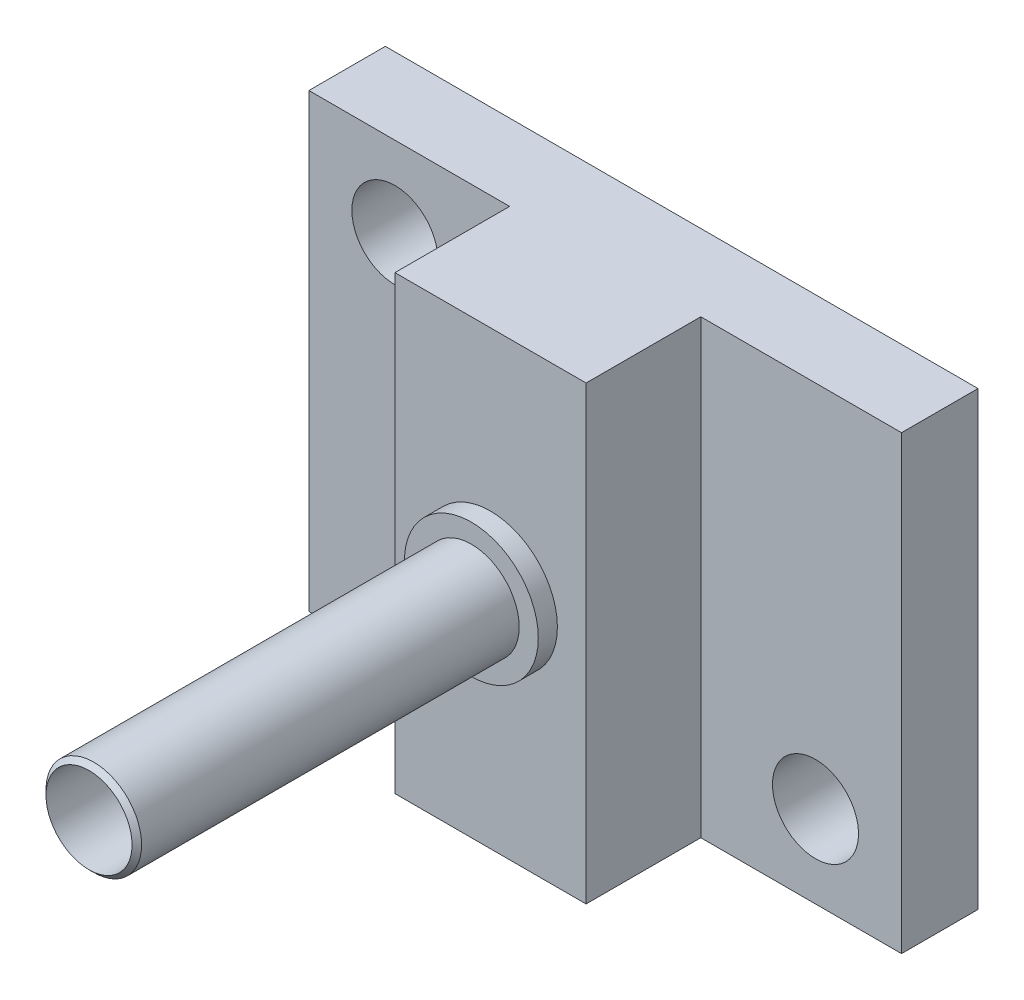
ISO-10303-21;
HEADER;
FILE_DESCRIPTION(('STEP AP214'),'2;1');
FILE_NAME('part.step','',(''),(''),'','','');
FILE_SCHEMA(('AUTOMOTIVE_DESIGN { 1 0 10303 214 1 1 1 1 }'));
ENDSEC;
DATA;
#1=APPLICATION_CONTEXT('core data for automotive mechanical design processes');
#2=APPLICATION_PROTOCOL_DEFINITION('international standard','automotive_design',2000,#1);
#3=PRODUCT_CONTEXT('',#1,'mechanical');
#4=PRODUCT('Part','Part','',(#3));
#5=PRODUCT_RELATED_PRODUCT_CATEGORY('part','',(#4));
#6=PRODUCT_DEFINITION_FORMATION('','',#4);
#7=PRODUCT_DEFINITION_CONTEXT('part definition',#1,'design');
#8=PRODUCT_DEFINITION('design','',#6,#7);
#9=PRODUCT_DEFINITION_SHAPE('','',#8);
#10=(LENGTH_UNIT() NAMED_UNIT(*) SI_UNIT(.MILLI.,.METRE.));
#11=(NAMED_UNIT(*) PLANE_ANGLE_UNIT() SI_UNIT($,.RADIAN.));
#12=(NAMED_UNIT(*) SI_UNIT($,.STERADIAN.) SOLID_ANGLE_UNIT());
#13=UNCERTAINTY_MEASURE_WITH_UNIT(LENGTH_MEASURE(1.E-05),#10,'distance_accuracy_value','');
#14=(GEOMETRIC_REPRESENTATION_CONTEXT(3) GLOBAL_UNCERTAINTY_ASSIGNED_CONTEXT((#13)) GLOBAL_UNIT_ASSIGNED_CONTEXT((#10,
#11,#12)) REPRESENTATION_CONTEXT('',''));
#15=CARTESIAN_POINT('',(0.,0.,0.));
#16=DIRECTION('',(0.,0.,1.));
#17=DIRECTION('',(1.,0.,0.));
#18=AXIS2_PLACEMENT_3D('',#15,#16,#17);
#19=CARTESIAN_POINT('',(0.,0.,5.));
#20=DIRECTION('',(0.,0.,-1.));
#21=DIRECTION('',(-1.,0.,0.));
#22=AXIS2_PLACEMENT_3D('',#19,#20,#21);
#23=PLANE('',#22);
#24=CARTESIAN_POINT('',(4.5,19.3,5.));
#25=DIRECTION('',(0.,0.,-1.));
#26=DIRECTION('',(-1.,0.,0.));
#27=AXIS2_PLACEMENT_3D('',#24,#25,#26);
#28=CIRCLE('',#27,2.25);
#29=CARTESIAN_POINT('',(2.25,19.3,5.));
#30=VERTEX_POINT('',#29);
#31=EDGE_CURVE('E457',#30,#30,#28,.T.);
#32=ORIENTED_EDGE('',*,*,#31,.T.);
#33=EDGE_LOOP('',(#32));
#34=FACE_BOUND('',#33,.T.);
#35=DIRECTION('',(0.,-1.,0.));
#36=VECTOR('',#35,1.);
#37=CARTESIAN_POINT('',(10.5,0.,5.));
#38=LINE('',#37,#36);
#39=CARTESIAN_POINT('',(10.5,23.6,5.));
#40=VERTEX_POINT('',#39);
#41=CARTESIAN_POINT('',(10.5,0.,5.));
#42=VERTEX_POINT('',#41);
#43=EDGE_CURVE('E59',#40,#42,#38,.T.);
#44=ORIENTED_EDGE('',*,*,#43,.F.);
#45=DIRECTION('',(-1.,0.,0.));
#46=VECTOR('',#45,1.);
#47=CARTESIAN_POINT('',(0.,23.6,5.));
#48=LINE('',#47,#46);
#49=CARTESIAN_POINT('',(0.,23.6,5.));
#50=VERTEX_POINT('',#49);
#51=EDGE_CURVE('E148',#40,#50,#48,.T.);
#52=ORIENTED_EDGE('',*,*,#51,.T.);
#53=DIRECTION('',(0.,-1.,0.));
#54=VECTOR('',#53,1.);
#55=CARTESIAN_POINT('',(0.,0.,5.));
#56=LINE('',#55,#54);
#57=CARTESIAN_POINT('',(0.,0.,5.));
#58=VERTEX_POINT('',#57);
#59=EDGE_CURVE('E139',#50,#58,#56,.T.);
#60=ORIENTED_EDGE('',*,*,#59,.T.);
#61=DIRECTION('',(1.,0.,0.));
#62=VECTOR('',#61,1.);
#63=CARTESIAN_POINT('',(0.,0.,5.));
#64=LINE('',#63,#62);
#65=EDGE_CURVE('E144',#58,#42,#64,.T.);
#66=ORIENTED_EDGE('',*,*,#65,.T.);
#67=EDGE_LOOP('',(#44,#52,#60,#66));
#68=FACE_BOUND('',#67,.T.);
#69=ADVANCED_FACE('F43',(#34,#68),#23,.F.);
#70=CARTESIAN_POINT('',(26.5,4.3,5.));
#71=DIRECTION('',(0.,0.,-1.));
#72=DIRECTION('',(-1.,0.,0.));
#73=AXIS2_PLACEMENT_3D('',#70,#71,#72);
#74=CIRCLE('',#73,2.25);
#75=CARTESIAN_POINT('',(24.25,4.3,5.));
#76=VERTEX_POINT('',#75);
#77=EDGE_CURVE('E456',#76,#76,#74,.T.);
#78=ORIENTED_EDGE('',*,*,#77,.T.);
#79=EDGE_LOOP('',(#78));
#80=FACE_BOUND('',#79,.T.);
#81=DIRECTION('',(0.,1.,0.));
#82=VECTOR('',#81,1.);
#83=CARTESIAN_POINT('',(20.5,0.,5.));
#84=LINE('',#83,#82);
#85=CARTESIAN_POINT('',(20.5,0.,5.));
#86=VERTEX_POINT('',#85);
#87=CARTESIAN_POINT('',(20.5,23.6,5.));
#88=VERTEX_POINT('',#87);
#89=EDGE_CURVE('E67',#86,#88,#84,.T.);
#90=ORIENTED_EDGE('',*,*,#89,.F.);
#91=CARTESIAN_POINT('',(31.,0.,5.));
#92=VERTEX_POINT('',#91);
#93=EDGE_CURVE('E142',#86,#92,#64,.T.);
#94=ORIENTED_EDGE('',*,*,#93,.T.);
#95=DIRECTION('',(0.,1.,0.));
#96=VECTOR('',#95,1.);
#97=CARTESIAN_POINT('',(31.,0.,5.));
#98=LINE('',#97,#96);
#99=CARTESIAN_POINT('',(31.,23.6,5.));
#100=VERTEX_POINT('',#99);
#101=EDGE_CURVE('E146',#92,#100,#98,.T.);
#102=ORIENTED_EDGE('',*,*,#101,.T.);
#103=EDGE_CURVE('E149',#100,#88,#48,.T.);
#104=ORIENTED_EDGE('',*,*,#103,.T.);
#105=EDGE_LOOP('',(#90,#94,#102,#104));
#106=FACE_BOUND('',#105,.T.);
#107=ADVANCED_FACE('F214',(#80,#106),#23,.F.);
#108=CARTESIAN_POINT('',(15.5,11.8,1.));
#109=DIRECTION('',(0.,0.,-1.));
#110=DIRECTION('',(-1.,0.,0.));
#111=AXIS2_PLACEMENT_3D('',#108,#109,#110);
#112=CYLINDRICAL_SURFACE('',#111,8.5);
#113=CARTESIAN_POINT('',(15.5,11.8,1.));
#114=DIRECTION('',(0.,0.,1.));
#115=DIRECTION('',(1.,0.,0.));
#116=AXIS2_PLACEMENT_3D('',#113,#114,#115);
#117=CIRCLE('',#116,8.5);
#118=CARTESIAN_POINT('',(24.,11.8,1.));
#119=VERTEX_POINT('',#118);
#120=EDGE_CURVE('E168',#119,#119,#117,.T.);
#121=ORIENTED_EDGE('',*,*,#120,.F.);
#122=EDGE_LOOP('',(#121));
#123=FACE_BOUND('',#122,.T.);
#124=CARTESIAN_POINT('',(15.5,11.8,0.));
#125=DIRECTION('',(0.,0.,1.));
#126=DIRECTION('',(1.,0.,0.));
#127=AXIS2_PLACEMENT_3D('',#124,#125,#126);
#128=CIRCLE('',#127,8.5);
#129=CARTESIAN_POINT('',(24.,11.8,0.));
#130=VERTEX_POINT('',#129);
#131=EDGE_CURVE('E167',#130,#130,#128,.T.);
#132=ORIENTED_EDGE('',*,*,#131,.T.);
#133=EDGE_LOOP('',(#132));
#134=FACE_BOUND('',#133,.T.);
#135=ADVANCED_FACE('F220',(#123,#134),#112,.T.);
#136=CARTESIAN_POINT('',(15.5,11.8,0.));
#137=DIRECTION('',(0.,0.,1.));
#138=DIRECTION('',(1.,0.,0.));
#139=AXIS2_PLACEMENT_3D('',#136,#137,#138);
#140=PLANE('',#139);
#141=ORIENTED_EDGE('',*,*,#131,.F.);
#142=EDGE_LOOP('',(#141));
#143=FACE_BOUND('',#142,.T.);
#144=ADVANCED_FACE('F238',(#143),#140,.F.);
#145=CARTESIAN_POINT('',(0.,0.,5.));
#146=DIRECTION('',(1.,0.,0.));
#147=DIRECTION('',(0.,0.,-1.));
#148=AXIS2_PLACEMENT_3D('',#145,#146,#147);
#149=PLANE('',#148);
#150=DIRECTION('',(0.,-1.,0.));
#151=VECTOR('',#150,1.);
#152=CARTESIAN_POINT('',(0.,0.,1.));
#153=LINE('',#152,#151);
#154=CARTESIAN_POINT('',(0.,23.6,1.));
#155=VERTEX_POINT('',#154);
#156=CARTESIAN_POINT('',(0.,0.,1.));
#157=VERTEX_POINT('',#156);
#158=EDGE_CURVE('E130',#155,#157,#153,.T.);
#159=ORIENTED_EDGE('',*,*,#158,.T.);
#160=DIRECTION('',(0.,0.,-1.));
#161=VECTOR('',#160,1.);
#162=CARTESIAN_POINT('',(0.,0.,5.));
#163=LINE('',#162,#161);
#164=EDGE_CURVE('E164',#58,#157,#163,.T.);
#165=ORIENTED_EDGE('',*,*,#164,.F.);
#166=ORIENTED_EDGE('',*,*,#59,.F.);
#167=DIRECTION('',(0.,0.,-1.));
#168=VECTOR('',#167,1.);
#169=CARTESIAN_POINT('',(0.,23.6,5.));
#170=LINE('',#169,#168);
#171=EDGE_CURVE('E150',#50,#155,#170,.T.);
#172=ORIENTED_EDGE('',*,*,#171,.T.);
#173=EDGE_LOOP('',(#159,#165,#166,#172));
#174=FACE_BOUND('',#173,.T.);
#175=ADVANCED_FACE('F235',(#174),#149,.F.);
#176=CARTESIAN_POINT('',(0.,0.,5.));
#177=DIRECTION('',(0.,1.,0.));
#178=DIRECTION('',(0.,0.,1.));
#179=AXIS2_PLACEMENT_3D('',#176,#177,#178);
#180=PLANE('',#179);
#181=DIRECTION('',(1.,0.,0.));
#182=VECTOR('',#181,1.);
#183=CARTESIAN_POINT('',(0.,0.,1.));
#184=LINE('',#183,#182);
#185=CARTESIAN_POINT('',(31.,0.,1.));
#186=VERTEX_POINT('',#185);
#187=EDGE_CURVE('E133',#157,#186,#184,.T.);
#188=ORIENTED_EDGE('',*,*,#187,.T.);
#189=DIRECTION('',(0.,0.,-1.));
#190=VECTOR('',#189,1.);
#191=CARTESIAN_POINT('',(31.,0.,5.));
#192=LINE('',#191,#190);
#193=EDGE_CURVE('E161',#92,#186,#192,.T.);
#194=ORIENTED_EDGE('',*,*,#193,.F.);
#195=ORIENTED_EDGE('',*,*,#93,.F.);
#196=DIRECTION('',(0.,0.,-1.));
#197=VECTOR('',#196,1.);
#198=CARTESIAN_POINT('',(20.5,0.,11.));
#199=LINE('',#198,#197);
#200=CARTESIAN_POINT('',(20.5,0.,11.));
#201=VERTEX_POINT('',#200);
#202=EDGE_CURVE('E115',#201,#86,#199,.T.);
#203=ORIENTED_EDGE('',*,*,#202,.F.);
#204=DIRECTION('',(1.,0.,0.));
#205=VECTOR('',#204,1.);
#206=CARTESIAN_POINT('',(10.5,0.,11.));
#207=LINE('',#206,#205);
#208=CARTESIAN_POINT('',(10.5,0.,11.));
#209=VERTEX_POINT('',#208);
#210=EDGE_CURVE('E109',#209,#201,#207,.T.);
#211=ORIENTED_EDGE('',*,*,#210,.F.);
#212=DIRECTION('',(0.,0.,-1.));
#213=VECTOR('',#212,1.);
#214=CARTESIAN_POINT('',(10.5,0.,11.));
#215=LINE('',#214,#213);
#216=EDGE_CURVE('E113',#209,#42,#215,.T.);
#217=ORIENTED_EDGE('',*,*,#216,.T.);
#218=ORIENTED_EDGE('',*,*,#65,.F.);
#219=ORIENTED_EDGE('',*,*,#164,.T.);
#220=EDGE_LOOP('',(#188,#194,#195,#203,#211,#217,#218,#219));
#221=FACE_BOUND('',#220,.T.);
#222=ADVANCED_FACE('F111',(#221),#180,.F.);
#223=CARTESIAN_POINT('',(31.,0.,5.));
#224=DIRECTION('',(-1.,0.,0.));
#225=DIRECTION('',(0.,0.,1.));
#226=AXIS2_PLACEMENT_3D('',#223,#224,#225);
#227=PLANE('',#226);
#228=DIRECTION('',(0.,1.,0.));
#229=VECTOR('',#228,1.);
#230=CARTESIAN_POINT('',(31.,0.,1.));
#231=LINE('',#230,#229);
#232=CARTESIAN_POINT('',(31.,23.6,1.));
#233=VERTEX_POINT('',#232);
#234=EDGE_CURVE('E153',#186,#233,#231,.T.);
#235=ORIENTED_EDGE('',*,*,#234,.T.);
#236=DIRECTION('',(0.,0.,-1.));
#237=VECTOR('',#236,1.);
#238=CARTESIAN_POINT('',(31.,23.6,5.));
#239=LINE('',#238,#237);
#240=EDGE_CURVE('E158',#100,#233,#239,.T.);
#241=ORIENTED_EDGE('',*,*,#240,.F.);
#242=ORIENTED_EDGE('',*,*,#101,.F.);
#243=ORIENTED_EDGE('',*,*,#193,.T.);
#244=EDGE_LOOP('',(#235,#241,#242,#243));
#245=FACE_BOUND('',#244,.T.);
#246=ADVANCED_FACE('F229',(#245),#227,.F.);
#247=CARTESIAN_POINT('',(0.,23.6,5.));
#248=DIRECTION('',(0.,-1.,0.));
#249=DIRECTION('',(0.,0.,-1.));
#250=AXIS2_PLACEMENT_3D('',#247,#248,#249);
#251=PLANE('',#250);
#252=DIRECTION('',(-1.,0.,0.));
#253=VECTOR('',#252,1.);
#254=CARTESIAN_POINT('',(0.,23.6,1.));
#255=LINE('',#254,#253);
#256=EDGE_CURVE('E143',#233,#155,#255,.T.);
#257=ORIENTED_EDGE('',*,*,#256,.T.);
#258=ORIENTED_EDGE('',*,*,#171,.F.);
#259=ORIENTED_EDGE('',*,*,#51,.F.);
#260=DIRECTION('',(0.,0.,-1.));
#261=VECTOR('',#260,1.);
#262=CARTESIAN_POINT('',(10.5,23.6,11.));
#263=LINE('',#262,#261);
#264=CARTESIAN_POINT('',(10.5,23.6,11.));
#265=VERTEX_POINT('',#264);
#266=EDGE_CURVE('E192',#265,#40,#263,.T.);
#267=ORIENTED_EDGE('',*,*,#266,.F.);
#268=DIRECTION('',(-1.,0.,0.));
#269=VECTOR('',#268,1.);
#270=CARTESIAN_POINT('',(10.5,23.6,11.));
#271=LINE('',#270,#269);
#272=CARTESIAN_POINT('',(20.5,23.6,11.));
#273=VERTEX_POINT('',#272);
#274=EDGE_CURVE('E124',#273,#265,#271,.T.);
#275=ORIENTED_EDGE('',*,*,#274,.F.);
#276=DIRECTION('',(0.,0.,-1.));
#277=VECTOR('',#276,1.);
#278=CARTESIAN_POINT('',(20.5,23.6,11.));
#279=LINE('',#278,#277);
#280=EDGE_CURVE('E135',#273,#88,#279,.T.);
#281=ORIENTED_EDGE('',*,*,#280,.T.);
#282=ORIENTED_EDGE('',*,*,#103,.F.);
#283=ORIENTED_EDGE('',*,*,#240,.T.);
#284=EDGE_LOOP('',(#257,#258,#259,#267,#275,#281,#282,#283));
#285=FACE_BOUND('',#284,.T.);
#286=ADVANCED_FACE('F199',(#285),#251,.F.);
#287=CARTESIAN_POINT('',(0.,0.,1.));
#288=DIRECTION('',(0.,0.,-1.));
#289=DIRECTION('',(-1.,0.,0.));
#290=AXIS2_PLACEMENT_3D('',#287,#288,#289);
#291=PLANE('',#290);
#292=CARTESIAN_POINT('',(26.5,4.3,1.));
#293=DIRECTION('',(0.,0.,-1.));
#294=DIRECTION('',(-1.,0.,0.));
#295=AXIS2_PLACEMENT_3D('',#292,#293,#294);
#296=CIRCLE('',#295,2.25);
#297=CARTESIAN_POINT('',(24.25,4.3,1.));
#298=VERTEX_POINT('',#297);
#299=EDGE_CURVE('E453',#298,#298,#296,.T.);
#300=ORIENTED_EDGE('',*,*,#299,.F.);
#301=EDGE_LOOP('',(#300));
#302=FACE_BOUND('',#301,.T.);
#303=CARTESIAN_POINT('',(4.5,19.3,1.));
#304=DIRECTION('',(0.,0.,-1.));
#305=DIRECTION('',(-1.,0.,0.));
#306=AXIS2_PLACEMENT_3D('',#303,#304,#305);
#307=CIRCLE('',#306,2.25);
#308=CARTESIAN_POINT('',(2.25,19.3,1.));
#309=VERTEX_POINT('',#308);
#310=EDGE_CURVE('E461',#309,#309,#307,.T.);
#311=ORIENTED_EDGE('',*,*,#310,.F.);
#312=EDGE_LOOP('',(#311));
#313=FACE_BOUND('',#312,.T.);
#314=ORIENTED_EDGE('',*,*,#120,.T.);
#315=EDGE_LOOP('',(#314));
#316=FACE_BOUND('',#315,.T.);
#317=ORIENTED_EDGE('',*,*,#158,.F.);
#318=ORIENTED_EDGE('',*,*,#256,.F.);
#319=ORIENTED_EDGE('',*,*,#234,.F.);
#320=ORIENTED_EDGE('',*,*,#187,.F.);
#321=EDGE_LOOP('',(#317,#318,#319,#320));
#322=FACE_BOUND('',#321,.T.);
#323=ADVANCED_FACE('F211',(#302,#313,#316,#322),#291,.T.);
#324=CARTESIAN_POINT('',(10.5,0.,11.));
#325=DIRECTION('',(1.,0.,0.));
#326=DIRECTION('',(0.,0.,-1.));
#327=AXIS2_PLACEMENT_3D('',#324,#325,#326);
#328=PLANE('',#327);
#329=ORIENTED_EDGE('',*,*,#43,.T.);
#330=ORIENTED_EDGE('',*,*,#216,.F.);
#331=DIRECTION('',(0.,-1.,0.));
#332=VECTOR('',#331,1.);
#333=CARTESIAN_POINT('',(10.5,0.,11.));
#334=LINE('',#333,#332);
#335=EDGE_CURVE('E119',#265,#209,#334,.T.);
#336=ORIENTED_EDGE('',*,*,#335,.F.);
#337=ORIENTED_EDGE('',*,*,#266,.T.);
#338=EDGE_LOOP('',(#329,#330,#336,#337));
#339=FACE_BOUND('',#338,.T.);
#340=ADVANCED_FACE('F129',(#339),#328,.F.);
#341=CARTESIAN_POINT('',(20.5,0.,11.));
#342=DIRECTION('',(-1.,0.,0.));
#343=DIRECTION('',(0.,0.,1.));
#344=AXIS2_PLACEMENT_3D('',#341,#342,#343);
#345=PLANE('',#344);
#346=ORIENTED_EDGE('',*,*,#89,.T.);
#347=ORIENTED_EDGE('',*,*,#280,.F.);
#348=DIRECTION('',(0.,1.,0.));
#349=VECTOR('',#348,1.);
#350=CARTESIAN_POINT('',(20.5,0.,11.));
#351=LINE('',#350,#349);
#352=EDGE_CURVE('E118',#201,#273,#351,.T.);
#353=ORIENTED_EDGE('',*,*,#352,.F.);
#354=ORIENTED_EDGE('',*,*,#202,.T.);
#355=EDGE_LOOP('',(#346,#347,#353,#354));
#356=FACE_BOUND('',#355,.T.);
#357=ADVANCED_FACE('F201',(#356),#345,.F.);
#358=CARTESIAN_POINT('',(0.,0.,11.));
#359=DIRECTION('',(0.,0.,-1.));
#360=DIRECTION('',(-1.,0.,0.));
#361=AXIS2_PLACEMENT_3D('',#358,#359,#360);
#362=PLANE('',#361);
#363=CARTESIAN_POINT('',(15.5,11.8,11.));
#364=DIRECTION('',(0.,0.,1.));
#365=DIRECTION('',(1.,0.,0.));
#366=AXIS2_PLACEMENT_3D('',#363,#364,#365);
#367=CIRCLE('',#366,3.5);
#368=CARTESIAN_POINT('',(19.,11.8,11.));
#369=VERTEX_POINT('',#368);
#370=EDGE_CURVE('E171',#369,#369,#367,.T.);
#371=ORIENTED_EDGE('',*,*,#370,.F.);
#372=EDGE_LOOP('',(#371));
#373=FACE_BOUND('',#372,.T.);
#374=ORIENTED_EDGE('',*,*,#335,.T.);
#375=ORIENTED_EDGE('',*,*,#210,.T.);
#376=ORIENTED_EDGE('',*,*,#352,.T.);
#377=ORIENTED_EDGE('',*,*,#274,.T.);
#378=EDGE_LOOP('',(#374,#375,#376,#377));
#379=FACE_BOUND('',#378,.T.);
#380=ADVANCED_FACE('F122',(#373,#379),#362,.F.);
#381=CARTESIAN_POINT('',(15.5,11.8,12.));
#382=DIRECTION('',(0.,0.,-1.));
#383=DIRECTION('',(-1.,0.,0.));
#384=AXIS2_PLACEMENT_3D('',#381,#382,#383);
#385=CYLINDRICAL_SURFACE('',#384,3.5);
#386=CARTESIAN_POINT('',(15.5,11.8,12.));
#387=DIRECTION('',(0.,0.,1.));
#388=DIRECTION('',(1.,0.,0.));
#389=AXIS2_PLACEMENT_3D('',#386,#387,#388);
#390=CIRCLE('',#389,3.5);
#391=CARTESIAN_POINT('',(19.,11.8,12.));
#392=VERTEX_POINT('',#391);
#393=EDGE_CURVE('E187',#392,#392,#390,.T.);
#394=ORIENTED_EDGE('',*,*,#393,.F.);
#395=EDGE_LOOP('',(#394));
#396=FACE_BOUND('',#395,.T.);
#397=ORIENTED_EDGE('',*,*,#370,.T.);
#398=EDGE_LOOP('',(#397));
#399=FACE_BOUND('',#398,.T.);
#400=ADVANCED_FACE('F208',(#396,#399),#385,.T.);
#401=CARTESIAN_POINT('',(15.5,11.8,12.));
#402=DIRECTION('',(0.,0.,1.));
#403=DIRECTION('',(1.,0.,0.));
#404=AXIS2_PLACEMENT_3D('',#401,#402,#403);
#405=PLANE('',#404);
#406=CARTESIAN_POINT('',(15.5,11.8,12.));
#407=DIRECTION('',(0.,0.,1.));
#408=DIRECTION('',(1.,0.,0.));
#409=AXIS2_PLACEMENT_3D('',#406,#407,#408);
#410=CIRCLE('',#409,2.5);
#411=CARTESIAN_POINT('',(18.,11.8,12.));
#412=VERTEX_POINT('',#411);
#413=EDGE_CURVE('E174',#412,#412,#410,.T.);
#414=ORIENTED_EDGE('',*,*,#413,.F.);
#415=EDGE_LOOP('',(#414));
#416=FACE_BOUND('',#415,.T.);
#417=ORIENTED_EDGE('',*,*,#393,.T.);
#418=EDGE_LOOP('',(#417));
#419=FACE_BOUND('',#418,.T.);
#420=ADVANCED_FACE('F313',(#416,#419),#405,.T.);
#421=CARTESIAN_POINT('',(15.5,11.8,32.25));
#422=DIRECTION('',(0.,0.,-1.));
#423=DIRECTION('',(-1.,0.,0.));
#424=AXIS2_PLACEMENT_3D('',#421,#422,#423);
#425=CYLINDRICAL_SURFACE('',#424,2.5);
#426=CARTESIAN_POINT('',(15.5,11.8,31.75));
#427=DIRECTION('',(0.,0.,1.));
#428=DIRECTION('',(1.,0.,0.));
#429=AXIS2_PLACEMENT_3D('',#426,#427,#428);
#430=CIRCLE('',#429,2.5);
#431=CARTESIAN_POINT('',(18.,11.8,31.75));
#432=VERTEX_POINT('',#431);
#433=EDGE_CURVE('E11',#432,#432,#430,.F.);
#434=ORIENTED_EDGE('',*,*,#433,.T.);
#435=EDGE_LOOP('',(#434));
#436=FACE_BOUND('',#435,.T.);
#437=ORIENTED_EDGE('',*,*,#413,.T.);
#438=EDGE_LOOP('',(#437));
#439=FACE_BOUND('',#438,.T.);
#440=ADVANCED_FACE('F324',(#436,#439),#425,.T.);
#441=CARTESIAN_POINT('',(15.5,11.8,20.25));
#442=DIRECTION('',(0.,0.,1.));
#443=DIRECTION('',(1.,0.,0.));
#444=AXIS2_PLACEMENT_3D('',#441,#442,#443);
#445=CYLINDRICAL_SURFACE('',#444,2.25);
#446=CARTESIAN_POINT('',(15.5,11.8,32.));
#447=DIRECTION('',(0.,0.,-1.));
#448=DIRECTION('',(-1.,0.,0.));
#449=AXIS2_PLACEMENT_3D('',#446,#447,#448);
#450=CIRCLE('',#449,2.25);
#451=CARTESIAN_POINT('',(13.25,11.8,32.));
#452=VERTEX_POINT('',#451);
#453=EDGE_CURVE('E52',#452,#452,#450,.F.);
#454=ORIENTED_EDGE('',*,*,#453,.T.);
#455=EDGE_LOOP('',(#454));
#456=FACE_BOUND('',#455,.T.);
#457=CARTESIAN_POINT('',(15.5,11.8,20.25));
#458=DIRECTION('',(0.,0.,1.));
#459=DIRECTION('',(1.,0.,0.));
#460=AXIS2_PLACEMENT_3D('',#457,#458,#459);
#461=CIRCLE('',#460,2.25);
#462=CARTESIAN_POINT('',(17.75,11.8,20.25));
#463=VERTEX_POINT('',#462);
#464=EDGE_CURVE('E185',#463,#463,#461,.T.);
#465=ORIENTED_EDGE('',*,*,#464,.F.);
#466=EDGE_LOOP('',(#465));
#467=FACE_BOUND('',#466,.T.);
#468=ADVANCED_FACE('F338',(#456,#467),#445,.F.);
#469=CARTESIAN_POINT('',(15.5,11.8,20.25));
#470=DIRECTION('',(0.,0.,1.));
#471=DIRECTION('',(1.,0.,0.));
#472=AXIS2_PLACEMENT_3D('',#469,#470,#471);
#473=PLANE('',#472);
#474=ORIENTED_EDGE('',*,*,#464,.T.);
#475=EDGE_LOOP('',(#474));
#476=FACE_BOUND('',#475,.T.);
#477=ADVANCED_FACE('F333',(#476),#473,.T.);
#478=CARTESIAN_POINT('',(4.5,19.3,32.25));
#479=DIRECTION('',(0.,0.,-1.));
#480=DIRECTION('',(-1.,0.,0.));
#481=AXIS2_PLACEMENT_3D('',#478,#479,#480);
#482=CYLINDRICAL_SURFACE('',#481,2.25);
#483=ORIENTED_EDGE('',*,*,#310,.T.);
#484=EDGE_LOOP('',(#483));
#485=FACE_BOUND('',#484,.T.);
#486=ORIENTED_EDGE('',*,*,#31,.F.);
#487=EDGE_LOOP('',(#486));
#488=FACE_BOUND('',#487,.T.);
#489=ADVANCED_FACE('F337',(#485,#488),#482,.F.);
#490=CARTESIAN_POINT('',(26.5,4.3,32.25));
#491=DIRECTION('',(0.,0.,-1.));
#492=DIRECTION('',(-1.,0.,0.));
#493=AXIS2_PLACEMENT_3D('',#490,#491,#492);
#494=CYLINDRICAL_SURFACE('',#493,2.25);
#495=ORIENTED_EDGE('',*,*,#299,.T.);
#496=EDGE_LOOP('',(#495));
#497=FACE_BOUND('',#496,.T.);
#498=ORIENTED_EDGE('',*,*,#77,.F.);
#499=EDGE_LOOP('',(#498));
#500=FACE_BOUND('',#499,.T.);
#501=ADVANCED_FACE('F417',(#497,#500),#494,.F.);
#502=CARTESIAN_POINT('',(15.5,11.8,32.25));
#503=DIRECTION('',(0.,0.,-1.));
#504=DIRECTION('',(-1.,0.,0.));
#505=AXIS2_PLACEMENT_3D('',#502,#503,#504);
#506=CONICAL_SURFACE('',#505,1.99999999999999,0.785398163397457);
#507=ORIENTED_EDGE('',*,*,#433,.F.);
#508=EDGE_LOOP('',(#507));
#509=FACE_BOUND('',#508,.T.);
#510=ORIENTED_EDGE('',*,*,#453,.F.);
#511=EDGE_LOOP('',(#510));
#512=FACE_BOUND('',#511,.T.);
#513=ADVANCED_FACE('F46',(#509,#512),#506,.T.);
#514=CLOSED_SHELL('',(#69,#107,#135,#144,#175,#222,#246,#286,#323,#340,#357,#380,#400,#420,#440,
#468,#477,#489,#501,#513));
#515=MANIFOLD_SOLID_BREP('B2',#514);
#516=ADVANCED_BREP_SHAPE_REPRESENTATION('',(#18,#515),#14);
#517=SHAPE_DEFINITION_REPRESENTATION(#9,#516);
ENDSEC;
END-ISO-10303-21;
